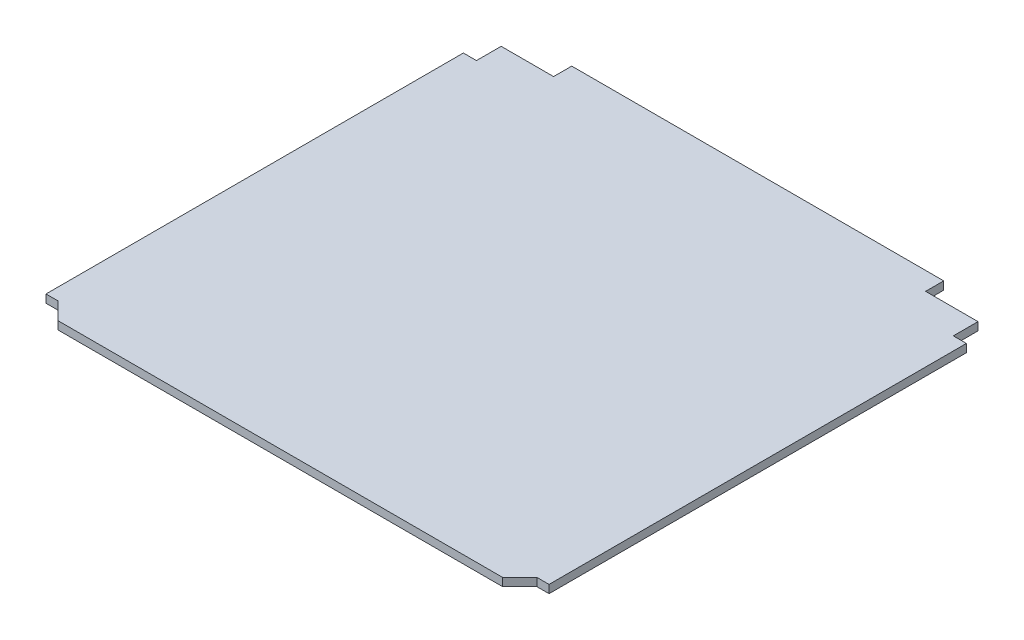
ISO-10303-21;
HEADER;
FILE_DESCRIPTION(('STEP AP214'),'2;1');
FILE_NAME('part.step','',(''),(''),'','','');
FILE_SCHEMA(('AUTOMOTIVE_DESIGN { 1 0 10303 214 1 1 1 1 }'));
ENDSEC;
DATA;
#1=APPLICATION_CONTEXT('core data for automotive mechanical design processes');
#2=APPLICATION_PROTOCOL_DEFINITION('international standard','automotive_design',2000,#1);
#3=PRODUCT_CONTEXT('',#1,'mechanical');
#4=PRODUCT('Part','Part','',(#3));
#5=PRODUCT_RELATED_PRODUCT_CATEGORY('part','',(#4));
#6=PRODUCT_DEFINITION_FORMATION('','',#4);
#7=PRODUCT_DEFINITION_CONTEXT('part definition',#1,'design');
#8=PRODUCT_DEFINITION('design','',#6,#7);
#9=PRODUCT_DEFINITION_SHAPE('','',#8);
#10=(LENGTH_UNIT() NAMED_UNIT(*) SI_UNIT(.MILLI.,.METRE.));
#11=(NAMED_UNIT(*) PLANE_ANGLE_UNIT() SI_UNIT($,.RADIAN.));
#12=(NAMED_UNIT(*) SI_UNIT($,.STERADIAN.) SOLID_ANGLE_UNIT());
#13=UNCERTAINTY_MEASURE_WITH_UNIT(LENGTH_MEASURE(1.E-05),#10,'distance_accuracy_value','');
#14=(GEOMETRIC_REPRESENTATION_CONTEXT(3) GLOBAL_UNCERTAINTY_ASSIGNED_CONTEXT((#13)) GLOBAL_UNIT_ASSIGNED_CONTEXT((#10,
#11,#12)) REPRESENTATION_CONTEXT('',''));
#15=CARTESIAN_POINT('',(0.,0.,0.));
#16=DIRECTION('',(0.,0.,1.));
#17=DIRECTION('',(1.,0.,0.));
#18=AXIS2_PLACEMENT_3D('',#15,#16,#17);
#19=CARTESIAN_POINT('',(0.,0.8,0.));
#20=DIRECTION('',(0.,1.,0.));
#21=DIRECTION('',(0.,0.,1.));
#22=AXIS2_PLACEMENT_3D('',#19,#20,#21);
#23=PLANE('',#22);
#24=DIRECTION('',(0.707106781186553,0.,0.707106781186542));
#25=VECTOR('',#24,1.);
#26=CARTESIAN_POINT('',(-44.4499999999997,0.8,44.4500000000004));
#27=LINE('',#26,#25);
#28=CARTESIAN_POINT('',(-47.5000000000001,0.8,41.4));
#29=VERTEX_POINT('',#28);
#30=CARTESIAN_POINT('',(-44.1000000000001,0.8,44.8));
#31=VERTEX_POINT('',#30);
#32=EDGE_CURVE('E46',#29,#31,#27,.T.);
#33=ORIENTED_EDGE('',*,*,#32,.T.);
#34=DIRECTION('',(1.,0.,0.));
#35=VECTOR('',#34,1.);
#36=CARTESIAN_POINT('',(0.,0.8,44.8));
#37=LINE('',#36,#35);
#38=CARTESIAN_POINT('',(44.0999999999991,0.8,44.8));
#39=VERTEX_POINT('',#38);
#40=EDGE_CURVE('E152',#31,#39,#37,.T.);
#41=ORIENTED_EDGE('',*,*,#40,.T.);
#42=DIRECTION('',(0.707106781186548,0.,-0.707106781186548));
#43=VECTOR('',#42,1.);
#44=CARTESIAN_POINT('',(44.4499999999995,0.8,44.4499999999995));
#45=LINE('',#44,#43);
#46=CARTESIAN_POINT('',(47.4999999999995,0.8,41.3999999999996));
#47=VERTEX_POINT('',#46);
#48=EDGE_CURVE('E11',#39,#47,#45,.T.);
#49=ORIENTED_EDGE('',*,*,#48,.T.);
#50=DIRECTION('',(1.,0.,1.96601993943993E-13));
#51=VECTOR('',#50,1.);
#52=CARTESIAN_POINT('',(-8.1393225492794E-12,0.8,41.3999999999902));
#53=LINE('',#52,#51);
#54=CARTESIAN_POINT('',(49.9000000000001,0.8,41.4));
#55=VERTEX_POINT('',#54);
#56=EDGE_CURVE('E173',#47,#55,#53,.T.);
#57=ORIENTED_EDGE('',*,*,#56,.T.);
#58=DIRECTION('',(0.,0.,-1.));
#59=VECTOR('',#58,1.);
#60=CARTESIAN_POINT('',(49.9000000000001,0.8,0.));
#61=LINE('',#60,#59);
#62=CARTESIAN_POINT('',(49.9000000000001,0.8,-41.4000000000031));
#63=VERTEX_POINT('',#62);
#64=EDGE_CURVE('E179',#55,#63,#61,.T.);
#65=ORIENTED_EDGE('',*,*,#64,.T.);
#66=DIRECTION('',(-1.,0.,0.));
#67=VECTOR('',#66,1.);
#68=CARTESIAN_POINT('',(0.,0.8,-41.4000000000031));
#69=LINE('',#68,#67);
#70=CARTESIAN_POINT('',(47.2999999999999,0.8,-41.4000000000031));
#71=VERTEX_POINT('',#70);
#72=EDGE_CURVE('E184',#63,#71,#69,.T.);
#73=ORIENTED_EDGE('',*,*,#72,.T.);
#74=DIRECTION('',(0.,0.,-1.));
#75=VECTOR('',#74,1.);
#76=CARTESIAN_POINT('',(47.2999999999999,0.8,0.));
#77=LINE('',#76,#75);
#78=CARTESIAN_POINT('',(47.2999999999999,0.8,-46.3));
#79=VERTEX_POINT('',#78);
#80=EDGE_CURVE('E305',#71,#79,#77,.T.);
#81=ORIENTED_EDGE('',*,*,#80,.T.);
#82=DIRECTION('',(-1.,0.,0.));
#83=VECTOR('',#82,1.);
#84=CARTESIAN_POINT('',(0.,0.8,-46.3));
#85=LINE('',#84,#83);
#86=CARTESIAN_POINT('',(36.8999999999997,0.8,-46.3));
#87=VERTEX_POINT('',#86);
#88=EDGE_CURVE('E299',#79,#87,#85,.T.);
#89=ORIENTED_EDGE('',*,*,#88,.T.);
#90=DIRECTION('',(0.,0.,-1.));
#91=VECTOR('',#90,1.);
#92=CARTESIAN_POINT('',(36.8999999999973,0.8,1.92033888790618E-12));
#93=LINE('',#92,#91);
#94=CARTESIAN_POINT('',(36.8999999999999,0.8,-49.9));
#95=VERTEX_POINT('',#94);
#96=EDGE_CURVE('E293',#87,#95,#93,.T.);
#97=ORIENTED_EDGE('',*,*,#96,.T.);
#98=DIRECTION('',(-1.,0.,0.));
#99=VECTOR('',#98,1.);
#100=CARTESIAN_POINT('',(0.,0.8,-49.9));
#101=LINE('',#100,#99);
#102=CARTESIAN_POINT('',(-36.9000000000002,0.8,-49.9));
#103=VERTEX_POINT('',#102);
#104=EDGE_CURVE('E284',#95,#103,#101,.T.);
#105=ORIENTED_EDGE('',*,*,#104,.T.);
#106=DIRECTION('',(0.,0.,1.));
#107=VECTOR('',#106,1.);
#108=CARTESIAN_POINT('',(-36.8999999999999,0.8,2.13370987545147E-13));
#109=LINE('',#108,#107);
#110=CARTESIAN_POINT('',(-36.9000000000002,0.8,-46.3));
#111=VERTEX_POINT('',#110);
#112=EDGE_CURVE('E278',#103,#111,#109,.T.);
#113=ORIENTED_EDGE('',*,*,#112,.T.);
#114=DIRECTION('',(-1.,0.,0.));
#115=VECTOR('',#114,1.);
#116=CARTESIAN_POINT('',(0.,0.8,-46.3));
#117=LINE('',#116,#115);
#118=CARTESIAN_POINT('',(-47.3000000000002,0.8,-46.3));
#119=VERTEX_POINT('',#118);
#120=EDGE_CURVE('E272',#111,#119,#117,.T.);
#121=ORIENTED_EDGE('',*,*,#120,.T.);
#122=DIRECTION('',(0.,0.,1.));
#123=VECTOR('',#122,1.);
#124=CARTESIAN_POINT('',(-47.3000000000002,0.8,0.));
#125=LINE('',#124,#123);
#126=CARTESIAN_POINT('',(-47.3000000000002,0.8,-41.4));
#127=VERTEX_POINT('',#126);
#128=EDGE_CURVE('E263',#119,#127,#125,.T.);
#129=ORIENTED_EDGE('',*,*,#128,.T.);
#130=DIRECTION('',(-1.,0.,0.));
#131=VECTOR('',#130,1.);
#132=CARTESIAN_POINT('',(1.10488541392987E-12,0.8,-41.3999999999987));
#133=LINE('',#132,#131);
#134=CARTESIAN_POINT('',(-49.9000000000001,0.8,-41.4000000000001));
#135=VERTEX_POINT('',#134);
#136=EDGE_CURVE('E257',#127,#135,#133,.T.);
#137=ORIENTED_EDGE('',*,*,#136,.T.);
#138=DIRECTION('',(0.,0.,1.));
#139=VECTOR('',#138,1.);
#140=CARTESIAN_POINT('',(-49.9000000000001,0.8,0.));
#141=LINE('',#140,#139);
#142=CARTESIAN_POINT('',(-49.9000000000001,0.8,41.4));
#143=VERTEX_POINT('',#142);
#144=EDGE_CURVE('E251',#135,#143,#141,.T.);
#145=ORIENTED_EDGE('',*,*,#144,.T.);
#146=DIRECTION('',(1.,0.,0.));
#147=VECTOR('',#146,1.);
#148=CARTESIAN_POINT('',(0.,0.8,41.4));
#149=LINE('',#148,#147);
#150=EDGE_CURVE('E325',#143,#29,#149,.T.);
#151=ORIENTED_EDGE('',*,*,#150,.T.);
#152=EDGE_LOOP('',(#33,#41,#49,#57,#65,#73,#81,#89,#97,#105,#113,#121,#129,#137,#145,#151));
#153=FACE_BOUND('',#152,.T.);
#154=ADVANCED_FACE('F37',(#153),#23,.T.);
#155=CARTESIAN_POINT('',(0.,-0.8,0.));
#156=DIRECTION('',(0.,1.,0.));
#157=DIRECTION('',(0.,0.,1.));
#158=AXIS2_PLACEMENT_3D('',#155,#156,#157);
#159=PLANE('',#158);
#160=DIRECTION('',(1.,0.,0.));
#161=VECTOR('',#160,1.);
#162=CARTESIAN_POINT('',(0.,-0.8,44.8));
#163=LINE('',#162,#161);
#164=CARTESIAN_POINT('',(-44.1000000000001,-0.8,44.8));
#165=VERTEX_POINT('',#164);
#166=CARTESIAN_POINT('',(44.0999999999991,-0.8,44.8));
#167=VERTEX_POINT('',#166);
#168=EDGE_CURVE('E54',#165,#167,#163,.T.);
#169=ORIENTED_EDGE('',*,*,#168,.F.);
#170=DIRECTION('',(0.707106781186553,0.,0.707106781186542));
#171=VECTOR('',#170,1.);
#172=CARTESIAN_POINT('',(-44.4499999999997,-0.8,44.4500000000004));
#173=LINE('',#172,#171);
#174=CARTESIAN_POINT('',(-47.5000000000001,-0.8,41.4));
#175=VERTEX_POINT('',#174);
#176=EDGE_CURVE('E61',#175,#165,#173,.T.);
#177=ORIENTED_EDGE('',*,*,#176,.F.);
#178=DIRECTION('',(1.,0.,0.));
#179=VECTOR('',#178,1.);
#180=CARTESIAN_POINT('',(0.,-0.8,41.4));
#181=LINE('',#180,#179);
#182=CARTESIAN_POINT('',(-49.9000000000001,-0.8,41.4));
#183=VERTEX_POINT('',#182);
#184=EDGE_CURVE('E178',#183,#175,#181,.T.);
#185=ORIENTED_EDGE('',*,*,#184,.F.);
#186=DIRECTION('',(0.,0.,1.));
#187=VECTOR('',#186,1.);
#188=CARTESIAN_POINT('',(-49.9000000000001,-0.8,0.));
#189=LINE('',#188,#187);
#190=CARTESIAN_POINT('',(-49.9000000000001,-0.8,-41.4000000000001));
#191=VERTEX_POINT('',#190);
#192=EDGE_CURVE('E182',#191,#183,#189,.T.);
#193=ORIENTED_EDGE('',*,*,#192,.F.);
#194=DIRECTION('',(-1.,0.,0.));
#195=VECTOR('',#194,1.);
#196=CARTESIAN_POINT('',(1.10488541392987E-12,-0.8,-41.3999999999987));
#197=LINE('',#196,#195);
#198=CARTESIAN_POINT('',(-47.3000000000002,-0.8,-41.4));
#199=VERTEX_POINT('',#198);
#200=EDGE_CURVE('E189',#199,#191,#197,.T.);
#201=ORIENTED_EDGE('',*,*,#200,.F.);
#202=DIRECTION('',(0.,0.,1.));
#203=VECTOR('',#202,1.);
#204=CARTESIAN_POINT('',(-47.3000000000002,-0.8,0.));
#205=LINE('',#204,#203);
#206=CARTESIAN_POINT('',(-47.3000000000002,-0.8,-46.3));
#207=VERTEX_POINT('',#206);
#208=EDGE_CURVE('E191',#207,#199,#205,.T.);
#209=ORIENTED_EDGE('',*,*,#208,.F.);
#210=DIRECTION('',(-1.,0.,0.));
#211=VECTOR('',#210,1.);
#212=CARTESIAN_POINT('',(0.,-0.8,-46.3));
#213=LINE('',#212,#211);
#214=CARTESIAN_POINT('',(-36.9000000000002,-0.8,-46.3));
#215=VERTEX_POINT('',#214);
#216=EDGE_CURVE('E193',#215,#207,#213,.T.);
#217=ORIENTED_EDGE('',*,*,#216,.F.);
#218=DIRECTION('',(0.,0.,1.));
#219=VECTOR('',#218,1.);
#220=CARTESIAN_POINT('',(-36.8999999999999,-0.8,2.13370987545147E-13));
#221=LINE('',#220,#219);
#222=CARTESIAN_POINT('',(-36.9000000000002,-0.8,-49.9));
#223=VERTEX_POINT('',#222);
#224=EDGE_CURVE('E195',#223,#215,#221,.T.);
#225=ORIENTED_EDGE('',*,*,#224,.F.);
#226=DIRECTION('',(-1.,0.,0.));
#227=VECTOR('',#226,1.);
#228=CARTESIAN_POINT('',(0.,-0.8,-49.9));
#229=LINE('',#228,#227);
#230=CARTESIAN_POINT('',(36.8999999999999,-0.8,-49.9));
#231=VERTEX_POINT('',#230);
#232=EDGE_CURVE('E197',#231,#223,#229,.T.);
#233=ORIENTED_EDGE('',*,*,#232,.F.);
#234=DIRECTION('',(0.,0.,-1.));
#235=VECTOR('',#234,1.);
#236=CARTESIAN_POINT('',(36.8999999999973,-0.8,1.92033888790618E-12));
#237=LINE('',#236,#235);
#238=CARTESIAN_POINT('',(36.8999999999997,-0.8,-46.3));
#239=VERTEX_POINT('',#238);
#240=EDGE_CURVE('E199',#239,#231,#237,.T.);
#241=ORIENTED_EDGE('',*,*,#240,.F.);
#242=DIRECTION('',(-1.,0.,0.));
#243=VECTOR('',#242,1.);
#244=CARTESIAN_POINT('',(0.,-0.8,-46.3));
#245=LINE('',#244,#243);
#246=CARTESIAN_POINT('',(47.2999999999999,-0.8,-46.3));
#247=VERTEX_POINT('',#246);
#248=EDGE_CURVE('E201',#247,#239,#245,.T.);
#249=ORIENTED_EDGE('',*,*,#248,.F.);
#250=DIRECTION('',(0.,0.,-1.));
#251=VECTOR('',#250,1.);
#252=CARTESIAN_POINT('',(47.2999999999999,-0.8,0.));
#253=LINE('',#252,#251);
#254=CARTESIAN_POINT('',(47.2999999999999,-0.8,-41.4000000000031));
#255=VERTEX_POINT('',#254);
#256=EDGE_CURVE('E203',#255,#247,#253,.T.);
#257=ORIENTED_EDGE('',*,*,#256,.F.);
#258=DIRECTION('',(-1.,0.,0.));
#259=VECTOR('',#258,1.);
#260=CARTESIAN_POINT('',(0.,-0.8,-41.4000000000031));
#261=LINE('',#260,#259);
#262=CARTESIAN_POINT('',(49.9000000000001,-0.8,-41.4000000000031));
#263=VERTEX_POINT('',#262);
#264=EDGE_CURVE('E205',#263,#255,#261,.T.);
#265=ORIENTED_EDGE('',*,*,#264,.F.);
#266=DIRECTION('',(0.,0.,-1.));
#267=VECTOR('',#266,1.);
#268=CARTESIAN_POINT('',(49.9000000000001,-0.8,0.));
#269=LINE('',#268,#267);
#270=CARTESIAN_POINT('',(49.9000000000001,-0.8,41.4));
#271=VERTEX_POINT('',#270);
#272=EDGE_CURVE('E207',#271,#263,#269,.T.);
#273=ORIENTED_EDGE('',*,*,#272,.F.);
#274=DIRECTION('',(1.,0.,1.96601993943993E-13));
#275=VECTOR('',#274,1.);
#276=CARTESIAN_POINT('',(-8.1393225492794E-12,-0.8,41.3999999999902));
#277=LINE('',#276,#275);
#278=CARTESIAN_POINT('',(47.4999999999995,-0.8,41.3999999999996));
#279=VERTEX_POINT('',#278);
#280=EDGE_CURVE('E209',#279,#271,#277,.T.);
#281=ORIENTED_EDGE('',*,*,#280,.F.);
#282=DIRECTION('',(0.707106781186548,0.,-0.707106781186548));
#283=VECTOR('',#282,1.);
#284=CARTESIAN_POINT('',(44.4499999999995,-0.8,44.4499999999995));
#285=LINE('',#284,#283);
#286=EDGE_CURVE('E41',#167,#279,#285,.T.);
#287=ORIENTED_EDGE('',*,*,#286,.F.);
#288=EDGE_LOOP('',(#169,#177,#185,#193,#201,#209,#217,#225,#233,#241,#249,#257,#265,#273,#281,#287));
#289=FACE_BOUND('',#288,.T.);
#290=ADVANCED_FACE('F243',(#289),#159,.F.);
#291=CARTESIAN_POINT('',(-44.4499999999997,0.8,44.4500000000004));
#292=DIRECTION('',(0.707106781186542,0.,-0.707106781186553));
#293=DIRECTION('',(-0.707106781186553,0.,-0.707106781186542));
#294=AXIS2_PLACEMENT_3D('',#291,#292,#293);
#295=PLANE('',#294);
#296=DIRECTION('',(0.,1.,0.));
#297=VECTOR('',#296,1.);
#298=CARTESIAN_POINT('',(-44.1000000000001,-0.8,44.8));
#299=LINE('',#298,#297);
#300=EDGE_CURVE('E157',#165,#31,#299,.T.);
#301=ORIENTED_EDGE('',*,*,#300,.T.);
#302=ORIENTED_EDGE('',*,*,#32,.F.);
#303=DIRECTION('',(0.,1.,0.));
#304=VECTOR('',#303,1.);
#305=CARTESIAN_POINT('',(-47.5000000000001,-0.8,41.4));
#306=LINE('',#305,#304);
#307=EDGE_CURVE('E210',#175,#29,#306,.T.);
#308=ORIENTED_EDGE('',*,*,#307,.F.);
#309=ORIENTED_EDGE('',*,*,#176,.T.);
#310=EDGE_LOOP('',(#301,#302,#308,#309));
#311=FACE_BOUND('',#310,.T.);
#312=ADVANCED_FACE('F39',(#311),#295,.F.);
#313=CARTESIAN_POINT('',(44.4499999999995,0.8,44.4499999999995));
#314=DIRECTION('',(-0.707106781186548,0.,-0.707106781186548));
#315=DIRECTION('',(-0.707106781186548,0.,0.707106781186548));
#316=AXIS2_PLACEMENT_3D('',#313,#314,#315);
#317=PLANE('',#316);
#318=DIRECTION('',(0.,1.,0.));
#319=VECTOR('',#318,1.);
#320=CARTESIAN_POINT('',(44.0999999999991,-0.8,44.8));
#321=LINE('',#320,#319);
#322=EDGE_CURVE('E149',#167,#39,#321,.T.);
#323=ORIENTED_EDGE('',*,*,#322,.F.);
#324=ORIENTED_EDGE('',*,*,#286,.T.);
#325=DIRECTION('',(0.,1.,0.));
#326=VECTOR('',#325,1.);
#327=CARTESIAN_POINT('',(47.4999999999995,-0.8,41.3999999999996));
#328=LINE('',#327,#326);
#329=EDGE_CURVE('E167',#279,#47,#328,.T.);
#330=ORIENTED_EDGE('',*,*,#329,.T.);
#331=ORIENTED_EDGE('',*,*,#48,.F.);
#332=EDGE_LOOP('',(#323,#324,#330,#331));
#333=FACE_BOUND('',#332,.T.);
#334=ADVANCED_FACE('F165',(#333),#317,.F.);
#335=CARTESIAN_POINT('',(-8.1393225492794E-12,-0.8,41.3999999999902));
#336=DIRECTION('',(-1.96601993943993E-13,0.,1.));
#337=DIRECTION('',(1.,0.,1.96601993943993E-13));
#338=AXIS2_PLACEMENT_3D('',#335,#336,#337);
#339=PLANE('',#338);
#340=ORIENTED_EDGE('',*,*,#329,.F.);
#341=ORIENTED_EDGE('',*,*,#280,.T.);
#342=DIRECTION('',(0.,1.,0.));
#343=VECTOR('',#342,1.);
#344=CARTESIAN_POINT('',(49.9000000000001,-0.8,41.4));
#345=LINE('',#344,#343);
#346=EDGE_CURVE('E171',#271,#55,#345,.T.);
#347=ORIENTED_EDGE('',*,*,#346,.T.);
#348=ORIENTED_EDGE('',*,*,#56,.F.);
#349=EDGE_LOOP('',(#340,#341,#347,#348));
#350=FACE_BOUND('',#349,.T.);
#351=ADVANCED_FACE('F174',(#350),#339,.T.);
#352=CARTESIAN_POINT('',(49.9000000000001,-0.8,0.));
#353=DIRECTION('',(1.,0.,0.));
#354=DIRECTION('',(0.,0.,-1.));
#355=AXIS2_PLACEMENT_3D('',#352,#353,#354);
#356=PLANE('',#355);
#357=ORIENTED_EDGE('',*,*,#346,.F.);
#358=ORIENTED_EDGE('',*,*,#272,.T.);
#359=DIRECTION('',(0.,1.,0.));
#360=VECTOR('',#359,1.);
#361=CARTESIAN_POINT('',(49.9000000000001,-0.8,-41.4000000000031));
#362=LINE('',#361,#360);
#363=EDGE_CURVE('E213',#263,#63,#362,.T.);
#364=ORIENTED_EDGE('',*,*,#363,.T.);
#365=ORIENTED_EDGE('',*,*,#64,.F.);
#366=EDGE_LOOP('',(#357,#358,#364,#365));
#367=FACE_BOUND('',#366,.T.);
#368=ADVANCED_FACE('F314',(#367),#356,.T.);
#369=CARTESIAN_POINT('',(0.,-0.8,-41.4000000000031));
#370=DIRECTION('',(0.,0.,-1.));
#371=DIRECTION('',(-1.,0.,0.));
#372=AXIS2_PLACEMENT_3D('',#369,#370,#371);
#373=PLANE('',#372);
#374=ORIENTED_EDGE('',*,*,#363,.F.);
#375=ORIENTED_EDGE('',*,*,#264,.T.);
#376=DIRECTION('',(0.,1.,0.));
#377=VECTOR('',#376,1.);
#378=CARTESIAN_POINT('',(47.2999999999999,-0.8,-41.4000000000031));
#379=LINE('',#378,#377);
#380=EDGE_CURVE('E215',#255,#71,#379,.T.);
#381=ORIENTED_EDGE('',*,*,#380,.T.);
#382=ORIENTED_EDGE('',*,*,#72,.F.);
#383=EDGE_LOOP('',(#374,#375,#381,#382));
#384=FACE_BOUND('',#383,.T.);
#385=ADVANCED_FACE('F311',(#384),#373,.T.);
#386=CARTESIAN_POINT('',(47.2999999999999,-0.8,0.));
#387=DIRECTION('',(1.,0.,0.));
#388=DIRECTION('',(0.,0.,-1.));
#389=AXIS2_PLACEMENT_3D('',#386,#387,#388);
#390=PLANE('',#389);
#391=ORIENTED_EDGE('',*,*,#380,.F.);
#392=ORIENTED_EDGE('',*,*,#256,.T.);
#393=DIRECTION('',(0.,1.,0.));
#394=VECTOR('',#393,1.);
#395=CARTESIAN_POINT('',(47.2999999999999,-0.8,-46.3));
#396=LINE('',#395,#394);
#397=EDGE_CURVE('E217',#247,#79,#396,.T.);
#398=ORIENTED_EDGE('',*,*,#397,.T.);
#399=ORIENTED_EDGE('',*,*,#80,.F.);
#400=EDGE_LOOP('',(#391,#392,#398,#399));
#401=FACE_BOUND('',#400,.T.);
#402=ADVANCED_FACE('F304',(#401),#390,.T.);
#403=CARTESIAN_POINT('',(0.,-0.8,-46.3));
#404=DIRECTION('',(0.,0.,-1.));
#405=DIRECTION('',(-1.,0.,0.));
#406=AXIS2_PLACEMENT_3D('',#403,#404,#405);
#407=PLANE('',#406);
#408=ORIENTED_EDGE('',*,*,#397,.F.);
#409=ORIENTED_EDGE('',*,*,#248,.T.);
#410=DIRECTION('',(0.,1.,0.));
#411=VECTOR('',#410,1.);
#412=CARTESIAN_POINT('',(36.8999999999997,-0.8,-46.3));
#413=LINE('',#412,#411);
#414=EDGE_CURVE('E219',#239,#87,#413,.T.);
#415=ORIENTED_EDGE('',*,*,#414,.T.);
#416=ORIENTED_EDGE('',*,*,#88,.F.);
#417=EDGE_LOOP('',(#408,#409,#415,#416));
#418=FACE_BOUND('',#417,.T.);
#419=ADVANCED_FACE('F298',(#418),#407,.T.);
#420=CARTESIAN_POINT('',(36.8999999999973,-0.8,1.92033888790618E-12));
#421=DIRECTION('',(1.,0.,0.));
#422=DIRECTION('',(0.,0.,-1.));
#423=AXIS2_PLACEMENT_3D('',#420,#421,#422);
#424=PLANE('',#423);
#425=ORIENTED_EDGE('',*,*,#414,.F.);
#426=ORIENTED_EDGE('',*,*,#240,.T.);
#427=DIRECTION('',(0.,1.,0.));
#428=VECTOR('',#427,1.);
#429=CARTESIAN_POINT('',(36.8999999999999,-0.8,-49.9));
#430=LINE('',#429,#428);
#431=EDGE_CURVE('E221',#231,#95,#430,.T.);
#432=ORIENTED_EDGE('',*,*,#431,.T.);
#433=ORIENTED_EDGE('',*,*,#96,.F.);
#434=EDGE_LOOP('',(#425,#426,#432,#433));
#435=FACE_BOUND('',#434,.T.);
#436=ADVANCED_FACE('F291',(#435),#424,.T.);
#437=CARTESIAN_POINT('',(0.,-0.8,-49.9));
#438=DIRECTION('',(0.,0.,-1.));
#439=DIRECTION('',(-1.,0.,0.));
#440=AXIS2_PLACEMENT_3D('',#437,#438,#439);
#441=PLANE('',#440);
#442=ORIENTED_EDGE('',*,*,#431,.F.);
#443=ORIENTED_EDGE('',*,*,#232,.T.);
#444=DIRECTION('',(0.,1.,0.));
#445=VECTOR('',#444,1.);
#446=CARTESIAN_POINT('',(-36.9000000000002,-0.8,-49.9));
#447=LINE('',#446,#445);
#448=EDGE_CURVE('E223',#223,#103,#447,.T.);
#449=ORIENTED_EDGE('',*,*,#448,.T.);
#450=ORIENTED_EDGE('',*,*,#104,.F.);
#451=EDGE_LOOP('',(#442,#443,#449,#450));
#452=FACE_BOUND('',#451,.T.);
#453=ADVANCED_FACE('F283',(#452),#441,.T.);
#454=CARTESIAN_POINT('',(-36.8999999999999,-0.8,2.13370987545147E-13));
#455=DIRECTION('',(-1.,0.,0.));
#456=DIRECTION('',(0.,0.,1.));
#457=AXIS2_PLACEMENT_3D('',#454,#455,#456);
#458=PLANE('',#457);
#459=ORIENTED_EDGE('',*,*,#448,.F.);
#460=ORIENTED_EDGE('',*,*,#224,.T.);
#461=DIRECTION('',(0.,1.,0.));
#462=VECTOR('',#461,1.);
#463=CARTESIAN_POINT('',(-36.9000000000002,-0.8,-46.3));
#464=LINE('',#463,#462);
#465=EDGE_CURVE('E225',#215,#111,#464,.T.);
#466=ORIENTED_EDGE('',*,*,#465,.T.);
#467=ORIENTED_EDGE('',*,*,#112,.F.);
#468=EDGE_LOOP('',(#459,#460,#466,#467));
#469=FACE_BOUND('',#468,.T.);
#470=ADVANCED_FACE('F277',(#469),#458,.T.);
#471=CARTESIAN_POINT('',(0.,-0.8,-46.3));
#472=DIRECTION('',(0.,0.,-1.));
#473=DIRECTION('',(-1.,0.,0.));
#474=AXIS2_PLACEMENT_3D('',#471,#472,#473);
#475=PLANE('',#474);
#476=ORIENTED_EDGE('',*,*,#465,.F.);
#477=ORIENTED_EDGE('',*,*,#216,.T.);
#478=DIRECTION('',(0.,1.,0.));
#479=VECTOR('',#478,1.);
#480=CARTESIAN_POINT('',(-47.3000000000002,-0.8,-46.3));
#481=LINE('',#480,#479);
#482=EDGE_CURVE('E227',#207,#119,#481,.T.);
#483=ORIENTED_EDGE('',*,*,#482,.T.);
#484=ORIENTED_EDGE('',*,*,#120,.F.);
#485=EDGE_LOOP('',(#476,#477,#483,#484));
#486=FACE_BOUND('',#485,.T.);
#487=ADVANCED_FACE('F270',(#486),#475,.T.);
#488=CARTESIAN_POINT('',(-47.3000000000002,-0.8,0.));
#489=DIRECTION('',(-1.,0.,0.));
#490=DIRECTION('',(0.,0.,1.));
#491=AXIS2_PLACEMENT_3D('',#488,#489,#490);
#492=PLANE('',#491);
#493=ORIENTED_EDGE('',*,*,#482,.F.);
#494=ORIENTED_EDGE('',*,*,#208,.T.);
#495=DIRECTION('',(0.,1.,0.));
#496=VECTOR('',#495,1.);
#497=CARTESIAN_POINT('',(-47.3000000000002,-0.8,-41.4));
#498=LINE('',#497,#496);
#499=EDGE_CURVE('E229',#199,#127,#498,.T.);
#500=ORIENTED_EDGE('',*,*,#499,.T.);
#501=ORIENTED_EDGE('',*,*,#128,.F.);
#502=EDGE_LOOP('',(#493,#494,#500,#501));
#503=FACE_BOUND('',#502,.T.);
#504=ADVANCED_FACE('F262',(#503),#492,.T.);
#505=CARTESIAN_POINT('',(1.10488541392987E-12,-0.8,-41.3999999999987));
#506=DIRECTION('',(0.,0.,-1.));
#507=DIRECTION('',(-1.,0.,0.));
#508=AXIS2_PLACEMENT_3D('',#505,#506,#507);
#509=PLANE('',#508);
#510=ORIENTED_EDGE('',*,*,#499,.F.);
#511=ORIENTED_EDGE('',*,*,#200,.T.);
#512=DIRECTION('',(0.,1.,0.));
#513=VECTOR('',#512,1.);
#514=CARTESIAN_POINT('',(-49.9000000000001,-0.8,-41.4000000000001));
#515=LINE('',#514,#513);
#516=EDGE_CURVE('E231',#191,#135,#515,.T.);
#517=ORIENTED_EDGE('',*,*,#516,.T.);
#518=ORIENTED_EDGE('',*,*,#136,.F.);
#519=EDGE_LOOP('',(#510,#511,#517,#518));
#520=FACE_BOUND('',#519,.T.);
#521=ADVANCED_FACE('F256',(#520),#509,.T.);
#522=CARTESIAN_POINT('',(-49.9000000000001,-0.8,0.));
#523=DIRECTION('',(-1.,0.,0.));
#524=DIRECTION('',(0.,0.,1.));
#525=AXIS2_PLACEMENT_3D('',#522,#523,#524);
#526=PLANE('',#525);
#527=ORIENTED_EDGE('',*,*,#516,.F.);
#528=ORIENTED_EDGE('',*,*,#192,.T.);
#529=DIRECTION('',(0.,1.,0.));
#530=VECTOR('',#529,1.);
#531=CARTESIAN_POINT('',(-49.9000000000001,-0.8,41.4));
#532=LINE('',#531,#530);
#533=EDGE_CURVE('E233',#183,#143,#532,.T.);
#534=ORIENTED_EDGE('',*,*,#533,.T.);
#535=ORIENTED_EDGE('',*,*,#144,.F.);
#536=EDGE_LOOP('',(#527,#528,#534,#535));
#537=FACE_BOUND('',#536,.T.);
#538=ADVANCED_FACE('F248',(#537),#526,.T.);
#539=CARTESIAN_POINT('',(0.,-0.8,41.4));
#540=DIRECTION('',(0.,0.,1.));
#541=DIRECTION('',(1.,0.,0.));
#542=AXIS2_PLACEMENT_3D('',#539,#540,#541);
#543=PLANE('',#542);
#544=ORIENTED_EDGE('',*,*,#533,.F.);
#545=ORIENTED_EDGE('',*,*,#184,.T.);
#546=ORIENTED_EDGE('',*,*,#307,.T.);
#547=ORIENTED_EDGE('',*,*,#150,.F.);
#548=EDGE_LOOP('',(#544,#545,#546,#547));
#549=FACE_BOUND('',#548,.T.);
#550=ADVANCED_FACE('F241',(#549),#543,.T.);
#551=CARTESIAN_POINT('',(0.,-0.8,44.8));
#552=DIRECTION('',(0.,0.,1.));
#553=DIRECTION('',(1.,0.,0.));
#554=AXIS2_PLACEMENT_3D('',#551,#552,#553);
#555=PLANE('',#554);
#556=ORIENTED_EDGE('',*,*,#300,.F.);
#557=ORIENTED_EDGE('',*,*,#168,.T.);
#558=ORIENTED_EDGE('',*,*,#322,.T.);
#559=ORIENTED_EDGE('',*,*,#40,.F.);
#560=EDGE_LOOP('',(#556,#557,#558,#559));
#561=FACE_BOUND('',#560,.T.);
#562=ADVANCED_FACE('F151',(#561),#555,.T.);
#563=CLOSED_SHELL('',(#154,#290,#312,#334,#351,#368,#385,#402,#419,#436,#453,#470,#487,#504,
#521,#538,#550,#562));
#564=MANIFOLD_SOLID_BREP('B2',#563);
#565=ADVANCED_BREP_SHAPE_REPRESENTATION('',(#18,#564),#14);
#566=SHAPE_DEFINITION_REPRESENTATION(#9,#565);
ENDSEC;
END-ISO-10303-21;
